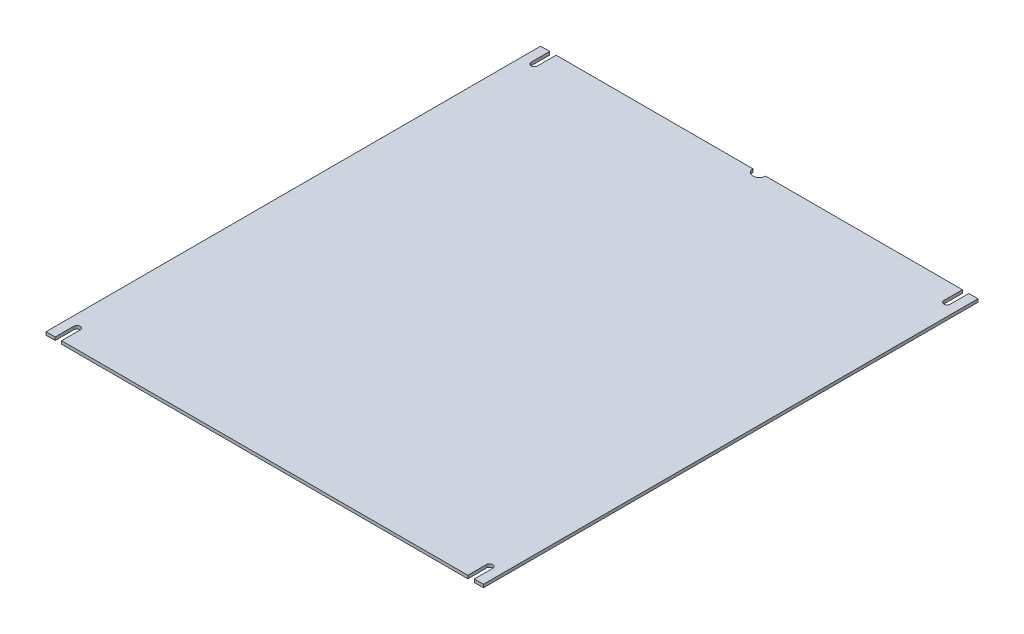
ISO-10303-21;
HEADER;
FILE_DESCRIPTION(('STEP AP214'),'2;1');
FILE_NAME('part.step','',(''),(''),'','','');
FILE_SCHEMA(('AUTOMOTIVE_DESIGN { 1 0 10303 214 1 1 1 1 }'));
ENDSEC;
DATA;
#1=APPLICATION_CONTEXT('core data for automotive mechanical design processes');
#2=APPLICATION_PROTOCOL_DEFINITION('international standard','automotive_design',2000,#1);
#3=PRODUCT_CONTEXT('',#1,'mechanical');
#4=PRODUCT('Part','Part','',(#3));
#5=PRODUCT_RELATED_PRODUCT_CATEGORY('part','',(#4));
#6=PRODUCT_DEFINITION_FORMATION('','',#4);
#7=PRODUCT_DEFINITION_CONTEXT('part definition',#1,'design');
#8=PRODUCT_DEFINITION('design','',#6,#7);
#9=PRODUCT_DEFINITION_SHAPE('','',#8);
#10=(LENGTH_UNIT() NAMED_UNIT(*) SI_UNIT(.MILLI.,.METRE.));
#11=(NAMED_UNIT(*) PLANE_ANGLE_UNIT() SI_UNIT($,.RADIAN.));
#12=(NAMED_UNIT(*) SI_UNIT($,.STERADIAN.) SOLID_ANGLE_UNIT());
#13=UNCERTAINTY_MEASURE_WITH_UNIT(LENGTH_MEASURE(1.E-05),#10,'distance_accuracy_value','');
#14=(GEOMETRIC_REPRESENTATION_CONTEXT(3) GLOBAL_UNCERTAINTY_ASSIGNED_CONTEXT((#13)) GLOBAL_UNIT_ASSIGNED_CONTEXT((#10,
#11,#12)) REPRESENTATION_CONTEXT('',''));
#15=CARTESIAN_POINT('',(0.,0.,0.));
#16=DIRECTION('',(0.,0.,1.));
#17=DIRECTION('',(1.,0.,0.));
#18=AXIS2_PLACEMENT_3D('',#15,#16,#17);
#19=CARTESIAN_POINT('',(0.,-3.175,-508.));
#20=DIRECTION('',(0.,0.,-1.));
#21=DIRECTION('',(-1.,0.,0.));
#22=AXIS2_PLACEMENT_3D('',#19,#20,#21);
#23=PLANE('',#22);
#24=DIRECTION('',(0.,1.,0.));
#25=VECTOR('',#24,1.);
#26=CARTESIAN_POINT('',(218.186,-3.175,-508.));
#27=LINE('',#26,#25);
#28=CARTESIAN_POINT('',(218.186,-3.175,-508.));
#29=VERTEX_POINT('',#28);
#30=CARTESIAN_POINT('',(218.186,0.,-508.));
#31=VERTEX_POINT('',#30);
#32=EDGE_CURVE('E52',#29,#31,#27,.T.);
#33=ORIENTED_EDGE('',*,*,#32,.F.);
#34=DIRECTION('',(-1.,0.,0.));
#35=VECTOR('',#34,1.);
#36=CARTESIAN_POINT('',(0.,-3.175,-508.));
#37=LINE('',#36,#35);
#38=CARTESIAN_POINT('',(16.002,-3.175,-508.));
#39=VERTEX_POINT('',#38);
#40=EDGE_CURVE('E201',#29,#39,#37,.T.);
#41=ORIENTED_EDGE('',*,*,#40,.T.);
#42=DIRECTION('',(0.,1.,0.));
#43=VECTOR('',#42,1.);
#44=CARTESIAN_POINT('',(16.002,-3.175,-508.));
#45=LINE('',#44,#43);
#46=CARTESIAN_POINT('',(16.002,0.,-508.));
#47=VERTEX_POINT('',#46);
#48=EDGE_CURVE('E235',#39,#47,#45,.T.);
#49=ORIENTED_EDGE('',*,*,#48,.T.);
#50=DIRECTION('',(-1.,0.,0.));
#51=VECTOR('',#50,1.);
#52=CARTESIAN_POINT('',(0.,0.,-508.));
#53=LINE('',#52,#51);
#54=EDGE_CURVE('E364',#31,#47,#53,.T.);
#55=ORIENTED_EDGE('',*,*,#54,.F.);
#56=EDGE_LOOP('',(#33,#41,#49,#55));
#57=FACE_BOUND('',#56,.T.);
#58=ADVANCED_FACE('F35',(#57),#23,.T.);
#59=CARTESIAN_POINT('',(0.,-3.175,0.));
#60=DIRECTION('',(0.,0.,1.));
#61=DIRECTION('',(1.,0.,0.));
#62=AXIS2_PLACEMENT_3D('',#59,#60,#61);
#63=PLANE('',#62);
#64=DIRECTION('',(0.,1.,0.));
#65=VECTOR('',#64,1.);
#66=CARTESIAN_POINT('',(439.928,-3.175,0.));
#67=LINE('',#66,#65);
#68=CARTESIAN_POINT('',(439.928,-3.175,0.));
#69=VERTEX_POINT('',#68);
#70=CARTESIAN_POINT('',(439.928,0.,0.));
#71=VERTEX_POINT('',#70);
#72=EDGE_CURVE('E316',#69,#71,#67,.T.);
#73=ORIENTED_EDGE('',*,*,#72,.F.);
#74=DIRECTION('',(1.,0.,0.));
#75=VECTOR('',#74,1.);
#76=CARTESIAN_POINT('',(0.,-3.175,0.));
#77=LINE('',#76,#75);
#78=CARTESIAN_POINT('',(449.326,-3.175,0.));
#79=VERTEX_POINT('',#78);
#80=EDGE_CURVE('E226',#69,#79,#77,.T.);
#81=ORIENTED_EDGE('',*,*,#80,.T.);
#82=DIRECTION('',(0.,1.,0.));
#83=VECTOR('',#82,1.);
#84=CARTESIAN_POINT('',(449.326,-3.175,0.));
#85=LINE('',#84,#83);
#86=CARTESIAN_POINT('',(449.326,0.,0.));
#87=VERTEX_POINT('',#86);
#88=EDGE_CURVE('E366',#79,#87,#85,.T.);
#89=ORIENTED_EDGE('',*,*,#88,.T.);
#90=DIRECTION('',(1.,0.,0.));
#91=VECTOR('',#90,1.);
#92=CARTESIAN_POINT('',(0.,0.,0.));
#93=LINE('',#92,#91);
#94=EDGE_CURVE('E354',#71,#87,#93,.T.);
#95=ORIENTED_EDGE('',*,*,#94,.F.);
#96=EDGE_LOOP('',(#73,#81,#89,#95));
#97=FACE_BOUND('',#96,.T.);
#98=ADVANCED_FACE('F393',(#97),#63,.T.);
#99=DIRECTION('',(0.,1.,0.));
#100=VECTOR('',#99,1.);
#101=CARTESIAN_POINT('',(433.324,-3.175,0.));
#102=LINE('',#101,#100);
#103=CARTESIAN_POINT('',(433.324,-3.175,0.));
#104=VERTEX_POINT('',#103);
#105=CARTESIAN_POINT('',(433.324,0.,0.));
#106=VERTEX_POINT('',#105);
#107=EDGE_CURVE('E312',#104,#106,#102,.T.);
#108=ORIENTED_EDGE('',*,*,#107,.T.);
#109=CARTESIAN_POINT('',(16.002,0.,0.));
#110=VERTEX_POINT('',#109);
#111=EDGE_CURVE('E348',#110,#106,#93,.T.);
#112=ORIENTED_EDGE('',*,*,#111,.F.);
#113=DIRECTION('',(0.,1.,0.));
#114=VECTOR('',#113,1.);
#115=CARTESIAN_POINT('',(16.002,-3.175,0.));
#116=LINE('',#115,#114);
#117=CARTESIAN_POINT('',(16.002,-3.175,0.));
#118=VERTEX_POINT('',#117);
#119=EDGE_CURVE('E291',#118,#110,#116,.T.);
#120=ORIENTED_EDGE('',*,*,#119,.F.);
#121=EDGE_CURVE('E224',#118,#104,#77,.T.);
#122=ORIENTED_EDGE('',*,*,#121,.T.);
#123=EDGE_LOOP('',(#108,#112,#120,#122));
#124=FACE_BOUND('',#123,.T.);
#125=ADVANCED_FACE('F346',(#124),#63,.T.);
#126=DIRECTION('',(0.,1.,0.));
#127=VECTOR('',#126,1.);
#128=CARTESIAN_POINT('',(231.14,-3.175,-508.));
#129=LINE('',#128,#127);
#130=CARTESIAN_POINT('',(231.14,-3.175,-508.));
#131=VERTEX_POINT('',#130);
#132=CARTESIAN_POINT('',(231.14,0.,-508.));
#133=VERTEX_POINT('',#132);
#134=EDGE_CURVE('E184',#131,#133,#129,.T.);
#135=ORIENTED_EDGE('',*,*,#134,.T.);
#136=CARTESIAN_POINT('',(433.324,0.,-508.));
#137=VERTEX_POINT('',#136);
#138=EDGE_CURVE('E363',#137,#133,#53,.T.);
#139=ORIENTED_EDGE('',*,*,#138,.F.);
#140=DIRECTION('',(0.,1.,0.));
#141=VECTOR('',#140,1.);
#142=CARTESIAN_POINT('',(433.324,-3.175,-508.));
#143=LINE('',#142,#141);
#144=CARTESIAN_POINT('',(433.324,-3.175,-508.));
#145=VERTEX_POINT('',#144);
#146=EDGE_CURVE('E205',#145,#137,#143,.T.);
#147=ORIENTED_EDGE('',*,*,#146,.F.);
#148=EDGE_CURVE('E199',#145,#131,#37,.T.);
#149=ORIENTED_EDGE('',*,*,#148,.T.);
#150=EDGE_LOOP('',(#135,#139,#147,#149));
#151=FACE_BOUND('',#150,.T.);
#152=ADVANCED_FACE('F204',(#151),#23,.T.);
#153=DIRECTION('',(0.,1.,0.));
#154=VECTOR('',#153,1.);
#155=CARTESIAN_POINT('',(9.39800000000006,-3.175,-508.));
#156=LINE('',#155,#154);
#157=CARTESIAN_POINT('',(9.39800000000006,-3.175,-508.));
#158=VERTEX_POINT('',#157);
#159=CARTESIAN_POINT('',(9.39800000000006,0.,-508.));
#160=VERTEX_POINT('',#159);
#161=EDGE_CURVE('E239',#158,#160,#156,.T.);
#162=ORIENTED_EDGE('',*,*,#161,.F.);
#163=CARTESIAN_POINT('',(0.,-3.175,-508.));
#164=VERTEX_POINT('',#163);
#165=EDGE_CURVE('E208',#158,#164,#37,.T.);
#166=ORIENTED_EDGE('',*,*,#165,.T.);
#167=DIRECTION('',(0.,1.,0.));
#168=VECTOR('',#167,1.);
#169=CARTESIAN_POINT('',(0.,-3.175,-508.));
#170=LINE('',#169,#168);
#171=CARTESIAN_POINT('',(0.,0.,-508.));
#172=VERTEX_POINT('',#171);
#173=EDGE_CURVE('E11',#164,#172,#170,.T.);
#174=ORIENTED_EDGE('',*,*,#173,.T.);
#175=EDGE_CURVE('E361',#160,#172,#53,.T.);
#176=ORIENTED_EDGE('',*,*,#175,.F.);
#177=EDGE_LOOP('',(#162,#166,#174,#176));
#178=FACE_BOUND('',#177,.T.);
#179=ADVANCED_FACE('F383',(#178),#23,.T.);
#180=CARTESIAN_POINT('',(0.,-3.175,0.));
#181=DIRECTION('',(-1.,0.,0.));
#182=DIRECTION('',(0.,0.,1.));
#183=AXIS2_PLACEMENT_3D('',#180,#181,#182);
#184=PLANE('',#183);
#185=DIRECTION('',(0.,0.,1.));
#186=VECTOR('',#185,1.);
#187=CARTESIAN_POINT('',(0.,0.,0.));
#188=LINE('',#187,#186);
#189=CARTESIAN_POINT('',(0.,0.,0.));
#190=VERTEX_POINT('',#189);
#191=EDGE_CURVE('E243',#172,#190,#188,.T.);
#192=ORIENTED_EDGE('',*,*,#191,.F.);
#193=ORIENTED_EDGE('',*,*,#173,.F.);
#194=DIRECTION('',(0.,0.,1.));
#195=VECTOR('',#194,1.);
#196=CARTESIAN_POINT('',(0.,-3.175,0.));
#197=LINE('',#196,#195);
#198=CARTESIAN_POINT('',(0.,-3.175,0.));
#199=VERTEX_POINT('',#198);
#200=EDGE_CURVE('E228',#164,#199,#197,.T.);
#201=ORIENTED_EDGE('',*,*,#200,.T.);
#202=DIRECTION('',(0.,1.,0.));
#203=VECTOR('',#202,1.);
#204=CARTESIAN_POINT('',(0.,-3.175,0.));
#205=LINE('',#204,#203);
#206=EDGE_CURVE('E39',#199,#190,#205,.T.);
#207=ORIENTED_EDGE('',*,*,#206,.T.);
#208=EDGE_LOOP('',(#192,#193,#201,#207));
#209=FACE_BOUND('',#208,.T.);
#210=ADVANCED_FACE('F37',(#209),#184,.T.);
#211=DIRECTION('',(0.,1.,0.));
#212=VECTOR('',#211,1.);
#213=CARTESIAN_POINT('',(439.928,-3.175,-508.));
#214=LINE('',#213,#212);
#215=CARTESIAN_POINT('',(439.928,-3.175,-508.));
#216=VERTEX_POINT('',#215);
#217=CARTESIAN_POINT('',(439.928,0.,-508.));
#218=VERTEX_POINT('',#217);
#219=EDGE_CURVE('E263',#216,#218,#214,.T.);
#220=ORIENTED_EDGE('',*,*,#219,.T.);
#221=CARTESIAN_POINT('',(449.326,0.,-508.));
#222=VERTEX_POINT('',#221);
#223=EDGE_CURVE('E231',#222,#218,#53,.T.);
#224=ORIENTED_EDGE('',*,*,#223,.F.);
#225=DIRECTION('',(0.,1.,0.));
#226=VECTOR('',#225,1.);
#227=CARTESIAN_POINT('',(449.326,-3.175,-508.));
#228=LINE('',#227,#226);
#229=CARTESIAN_POINT('',(449.326,-3.175,-508.));
#230=VERTEX_POINT('',#229);
#231=EDGE_CURVE('E44',#230,#222,#228,.T.);
#232=ORIENTED_EDGE('',*,*,#231,.F.);
#233=EDGE_CURVE('E206',#230,#216,#37,.T.);
#234=ORIENTED_EDGE('',*,*,#233,.T.);
#235=EDGE_LOOP('',(#220,#224,#232,#234));
#236=FACE_BOUND('',#235,.T.);
#237=ADVANCED_FACE('F397',(#236),#23,.T.);
#238=CARTESIAN_POINT('',(449.326,-3.175,0.));
#239=DIRECTION('',(1.,0.,0.));
#240=DIRECTION('',(0.,0.,-1.));
#241=AXIS2_PLACEMENT_3D('',#238,#239,#240);
#242=PLANE('',#241);
#243=DIRECTION('',(0.,0.,-1.));
#244=VECTOR('',#243,1.);
#245=CARTESIAN_POINT('',(449.326,0.,0.));
#246=LINE('',#245,#244);
#247=EDGE_CURVE('E357',#87,#222,#246,.T.);
#248=ORIENTED_EDGE('',*,*,#247,.F.);
#249=ORIENTED_EDGE('',*,*,#88,.F.);
#250=DIRECTION('',(0.,0.,-1.));
#251=VECTOR('',#250,1.);
#252=CARTESIAN_POINT('',(449.326,-3.175,0.));
#253=LINE('',#252,#251);
#254=EDGE_CURVE('E212',#79,#230,#253,.T.);
#255=ORIENTED_EDGE('',*,*,#254,.T.);
#256=ORIENTED_EDGE('',*,*,#231,.T.);
#257=EDGE_LOOP('',(#248,#249,#255,#256));
#258=FACE_BOUND('',#257,.T.);
#259=ADVANCED_FACE('F394',(#258),#242,.T.);
#260=DIRECTION('',(0.,1.,0.));
#261=VECTOR('',#260,1.);
#262=CARTESIAN_POINT('',(9.398,-3.175,0.));
#263=LINE('',#262,#261);
#264=CARTESIAN_POINT('',(9.398,-3.175,0.));
#265=VERTEX_POINT('',#264);
#266=CARTESIAN_POINT('',(9.398,0.,0.));
#267=VERTEX_POINT('',#266);
#268=EDGE_CURVE('E287',#265,#267,#263,.T.);
#269=ORIENTED_EDGE('',*,*,#268,.T.);
#270=EDGE_CURVE('E353',#190,#267,#93,.T.);
#271=ORIENTED_EDGE('',*,*,#270,.F.);
#272=ORIENTED_EDGE('',*,*,#206,.F.);
#273=EDGE_CURVE('E218',#199,#265,#77,.T.);
#274=ORIENTED_EDGE('',*,*,#273,.T.);
#275=EDGE_LOOP('',(#269,#271,#272,#274));
#276=FACE_BOUND('',#275,.T.);
#277=ADVANCED_FACE('F378',(#276),#63,.T.);
#278=CARTESIAN_POINT('',(0.,-3.175,0.));
#279=DIRECTION('',(0.,-1.,0.));
#280=DIRECTION('',(0.,0.,-1.));
#281=AXIS2_PLACEMENT_3D('',#278,#279,#280);
#282=PLANE('',#281);
#283=CARTESIAN_POINT('',(224.663,-3.175,-508.));
#284=DIRECTION('',(0.,1.,0.));
#285=DIRECTION('',(0.,0.,1.));
#286=AXIS2_PLACEMENT_3D('',#283,#284,#285);
#287=CIRCLE('',#286,6.47700000000001);
#288=EDGE_CURVE('E187',#29,#131,#287,.T.);
#289=ORIENTED_EDGE('',*,*,#288,.T.);
#290=ORIENTED_EDGE('',*,*,#148,.F.);
#291=DIRECTION('',(0.,0.,1.));
#292=VECTOR('',#291,1.);
#293=CARTESIAN_POINT('',(433.324,-3.175,-488.95));
#294=LINE('',#293,#292);
#295=CARTESIAN_POINT('',(433.324,-3.175,-488.95));
#296=VERTEX_POINT('',#295);
#297=EDGE_CURVE('E264',#145,#296,#294,.T.);
#298=ORIENTED_EDGE('',*,*,#297,.T.);
#299=CARTESIAN_POINT('',(436.626,-3.175,-488.95));
#300=DIRECTION('',(0.,1.,0.));
#301=DIRECTION('',(0.,0.,1.));
#302=AXIS2_PLACEMENT_3D('',#299,#300,#301);
#303=CIRCLE('',#302,3.30200000000003);
#304=CARTESIAN_POINT('',(439.928,-3.175,-488.95));
#305=VERTEX_POINT('',#304);
#306=EDGE_CURVE('E272',#296,#305,#303,.T.);
#307=ORIENTED_EDGE('',*,*,#306,.T.);
#308=DIRECTION('',(0.,0.,-1.));
#309=VECTOR('',#308,1.);
#310=CARTESIAN_POINT('',(439.928,-3.175,-508.));
#311=LINE('',#310,#309);
#312=EDGE_CURVE('E279',#305,#216,#311,.T.);
#313=ORIENTED_EDGE('',*,*,#312,.T.);
#314=ORIENTED_EDGE('',*,*,#233,.F.);
#315=ORIENTED_EDGE('',*,*,#254,.F.);
#316=ORIENTED_EDGE('',*,*,#80,.F.);
#317=DIRECTION('',(0.,0.,-1.));
#318=VECTOR('',#317,1.);
#319=CARTESIAN_POINT('',(439.928,-3.175,0.));
#320=LINE('',#319,#318);
#321=CARTESIAN_POINT('',(439.928,-3.175,-19.05));
#322=VERTEX_POINT('',#321);
#323=EDGE_CURVE('E313',#69,#322,#320,.T.);
#324=ORIENTED_EDGE('',*,*,#323,.T.);
#325=CARTESIAN_POINT('',(436.626,-3.175,-19.05));
#326=DIRECTION('',(0.,1.,0.));
#327=DIRECTION('',(0.,0.,1.));
#328=AXIS2_PLACEMENT_3D('',#325,#326,#327);
#329=CIRCLE('',#328,3.30200000000003);
#330=CARTESIAN_POINT('',(433.324,-3.175,-19.05));
#331=VERTEX_POINT('',#330);
#332=EDGE_CURVE('E322',#322,#331,#329,.T.);
#333=ORIENTED_EDGE('',*,*,#332,.T.);
#334=DIRECTION('',(0.,0.,1.));
#335=VECTOR('',#334,1.);
#336=CARTESIAN_POINT('',(433.324,-3.175,-19.05));
#337=LINE('',#336,#335);
#338=EDGE_CURVE('E328',#331,#104,#337,.T.);
#339=ORIENTED_EDGE('',*,*,#338,.T.);
#340=ORIENTED_EDGE('',*,*,#121,.F.);
#341=DIRECTION('',(0.,0.,-1.));
#342=VECTOR('',#341,1.);
#343=CARTESIAN_POINT('',(16.002,-3.175,-19.05));
#344=LINE('',#343,#342);
#345=CARTESIAN_POINT('',(16.002,-3.175,-19.05));
#346=VERTEX_POINT('',#345);
#347=EDGE_CURVE('E288',#118,#346,#344,.T.);
#348=ORIENTED_EDGE('',*,*,#347,.T.);
#349=CARTESIAN_POINT('',(12.7,-3.175,-19.05));
#350=DIRECTION('',(0.,1.,0.));
#351=DIRECTION('',(0.,0.,1.));
#352=AXIS2_PLACEMENT_3D('',#349,#350,#351);
#353=CIRCLE('',#352,3.302);
#354=CARTESIAN_POINT('',(9.398,-3.175,-19.05));
#355=VERTEX_POINT('',#354);
#356=EDGE_CURVE('E297',#346,#355,#353,.T.);
#357=ORIENTED_EDGE('',*,*,#356,.T.);
#358=DIRECTION('',(0.,0.,1.));
#359=VECTOR('',#358,1.);
#360=CARTESIAN_POINT('',(9.398,-3.175,-19.05));
#361=LINE('',#360,#359);
#362=EDGE_CURVE('E305',#355,#265,#361,.T.);
#363=ORIENTED_EDGE('',*,*,#362,.T.);
#364=ORIENTED_EDGE('',*,*,#273,.F.);
#365=ORIENTED_EDGE('',*,*,#200,.F.);
#366=ORIENTED_EDGE('',*,*,#165,.F.);
#367=DIRECTION('',(0.,0.,1.));
#368=VECTOR('',#367,1.);
#369=CARTESIAN_POINT('',(9.39800000000001,-3.175,-488.95));
#370=LINE('',#369,#368);
#371=CARTESIAN_POINT('',(9.39800000000001,-3.175,-488.95));
#372=VERTEX_POINT('',#371);
#373=EDGE_CURVE('E236',#158,#372,#370,.T.);
#374=ORIENTED_EDGE('',*,*,#373,.T.);
#375=CARTESIAN_POINT('',(12.7,-3.175,-488.95));
#376=DIRECTION('',(0.,1.,0.));
#377=DIRECTION('',(0.,0.,1.));
#378=AXIS2_PLACEMENT_3D('',#375,#376,#377);
#379=CIRCLE('',#378,3.30199999999999);
#380=CARTESIAN_POINT('',(16.002,-3.175,-488.95));
#381=VERTEX_POINT('',#380);
#382=EDGE_CURVE('E247',#372,#381,#379,.T.);
#383=ORIENTED_EDGE('',*,*,#382,.T.);
#384=DIRECTION('',(0.,0.,-1.));
#385=VECTOR('',#384,1.);
#386=CARTESIAN_POINT('',(16.002,-3.175,-508.));
#387=LINE('',#386,#385);
#388=EDGE_CURVE('E256',#381,#39,#387,.T.);
#389=ORIENTED_EDGE('',*,*,#388,.T.);
#390=ORIENTED_EDGE('',*,*,#40,.F.);
#391=EDGE_LOOP('',(#289,#290,#298,#307,#313,#314,#315,#316,#324,#333,#339,#340,#348,#357,#363,
#364,#365,#366,#374,#383,#389,#390));
#392=FACE_BOUND('',#391,.T.);
#393=ADVANCED_FACE('F197',(#392),#282,.T.);
#394=CARTESIAN_POINT('',(0.,0.,0.));
#395=DIRECTION('',(0.,-1.,0.));
#396=DIRECTION('',(0.,0.,-1.));
#397=AXIS2_PLACEMENT_3D('',#394,#395,#396);
#398=PLANE('',#397);
#399=ORIENTED_EDGE('',*,*,#138,.T.);
#400=CARTESIAN_POINT('',(224.663,0.,-508.));
#401=DIRECTION('',(0.,1.,0.));
#402=DIRECTION('',(0.,0.,1.));
#403=AXIS2_PLACEMENT_3D('',#400,#401,#402);
#404=CIRCLE('',#403,6.47700000000001);
#405=EDGE_CURVE('E188',#31,#133,#404,.T.);
#406=ORIENTED_EDGE('',*,*,#405,.F.);
#407=ORIENTED_EDGE('',*,*,#54,.T.);
#408=DIRECTION('',(0.,0.,-1.));
#409=VECTOR('',#408,1.);
#410=CARTESIAN_POINT('',(16.002,0.,-508.));
#411=LINE('',#410,#409);
#412=CARTESIAN_POINT('',(16.002,0.,-488.95));
#413=VERTEX_POINT('',#412);
#414=EDGE_CURVE('E248',#413,#47,#411,.T.);
#415=ORIENTED_EDGE('',*,*,#414,.F.);
#416=CARTESIAN_POINT('',(12.7,0.,-488.95));
#417=DIRECTION('',(0.,1.,0.));
#418=DIRECTION('',(0.,0.,1.));
#419=AXIS2_PLACEMENT_3D('',#416,#417,#418);
#420=CIRCLE('',#419,3.30199999999999);
#421=CARTESIAN_POINT('',(9.39800000000001,0.,-488.95));
#422=VERTEX_POINT('',#421);
#423=EDGE_CURVE('E251',#422,#413,#420,.T.);
#424=ORIENTED_EDGE('',*,*,#423,.F.);
#425=DIRECTION('',(0.,0.,1.));
#426=VECTOR('',#425,1.);
#427=CARTESIAN_POINT('',(9.39800000000001,0.,-488.95));
#428=LINE('',#427,#426);
#429=EDGE_CURVE('E244',#160,#422,#428,.T.);
#430=ORIENTED_EDGE('',*,*,#429,.F.);
#431=ORIENTED_EDGE('',*,*,#175,.T.);
#432=ORIENTED_EDGE('',*,*,#191,.T.);
#433=ORIENTED_EDGE('',*,*,#270,.T.);
#434=DIRECTION('',(0.,0.,1.));
#435=VECTOR('',#434,1.);
#436=CARTESIAN_POINT('',(9.398,0.,-19.05));
#437=LINE('',#436,#435);
#438=CARTESIAN_POINT('',(9.398,0.,-19.05));
#439=VERTEX_POINT('',#438);
#440=EDGE_CURVE('E298',#439,#267,#437,.T.);
#441=ORIENTED_EDGE('',*,*,#440,.F.);
#442=CARTESIAN_POINT('',(12.7,0.,-19.05));
#443=DIRECTION('',(0.,1.,0.));
#444=DIRECTION('',(0.,0.,1.));
#445=AXIS2_PLACEMENT_3D('',#442,#443,#444);
#446=CIRCLE('',#445,3.302);
#447=CARTESIAN_POINT('',(16.002,0.,-19.05));
#448=VERTEX_POINT('',#447);
#449=EDGE_CURVE('E300',#448,#439,#446,.T.);
#450=ORIENTED_EDGE('',*,*,#449,.F.);
#451=DIRECTION('',(0.,0.,-1.));
#452=VECTOR('',#451,1.);
#453=CARTESIAN_POINT('',(16.002,0.,-19.05));
#454=LINE('',#453,#452);
#455=EDGE_CURVE('E294',#110,#448,#454,.T.);
#456=ORIENTED_EDGE('',*,*,#455,.F.);
#457=ORIENTED_EDGE('',*,*,#111,.T.);
#458=DIRECTION('',(0.,0.,1.));
#459=VECTOR('',#458,1.);
#460=CARTESIAN_POINT('',(433.324,0.,-19.05));
#461=LINE('',#460,#459);
#462=CARTESIAN_POINT('',(433.324,0.,-19.05));
#463=VERTEX_POINT('',#462);
#464=EDGE_CURVE('E323',#463,#106,#461,.T.);
#465=ORIENTED_EDGE('',*,*,#464,.F.);
#466=CARTESIAN_POINT('',(436.626,0.,-19.05));
#467=DIRECTION('',(0.,1.,0.));
#468=DIRECTION('',(0.,0.,1.));
#469=AXIS2_PLACEMENT_3D('',#466,#467,#468);
#470=CIRCLE('',#469,3.30200000000003);
#471=CARTESIAN_POINT('',(439.928,0.,-19.05));
#472=VERTEX_POINT('',#471);
#473=EDGE_CURVE('E60',#472,#463,#470,.T.);
#474=ORIENTED_EDGE('',*,*,#473,.F.);
#475=DIRECTION('',(0.,0.,-1.));
#476=VECTOR('',#475,1.);
#477=CARTESIAN_POINT('',(439.928,0.,0.));
#478=LINE('',#477,#476);
#479=EDGE_CURVE('E319',#71,#472,#478,.T.);
#480=ORIENTED_EDGE('',*,*,#479,.F.);
#481=ORIENTED_EDGE('',*,*,#94,.T.);
#482=ORIENTED_EDGE('',*,*,#247,.T.);
#483=ORIENTED_EDGE('',*,*,#223,.T.);
#484=DIRECTION('',(0.,0.,-1.));
#485=VECTOR('',#484,1.);
#486=CARTESIAN_POINT('',(439.928,0.,-508.));
#487=LINE('',#486,#485);
#488=CARTESIAN_POINT('',(439.928,0.,-488.95));
#489=VERTEX_POINT('',#488);
#490=EDGE_CURVE('E273',#489,#218,#487,.T.);
#491=ORIENTED_EDGE('',*,*,#490,.F.);
#492=CARTESIAN_POINT('',(436.626,0.,-488.95));
#493=DIRECTION('',(0.,1.,0.));
#494=DIRECTION('',(0.,0.,1.));
#495=AXIS2_PLACEMENT_3D('',#492,#493,#494);
#496=CIRCLE('',#495,3.30200000000003);
#497=CARTESIAN_POINT('',(433.324,0.,-488.95));
#498=VERTEX_POINT('',#497);
#499=EDGE_CURVE('E275',#498,#489,#496,.T.);
#500=ORIENTED_EDGE('',*,*,#499,.F.);
#501=DIRECTION('',(0.,0.,1.));
#502=VECTOR('',#501,1.);
#503=CARTESIAN_POINT('',(433.324,0.,-488.95));
#504=LINE('',#503,#502);
#505=EDGE_CURVE('E269',#137,#498,#504,.T.);
#506=ORIENTED_EDGE('',*,*,#505,.F.);
#507=EDGE_LOOP('',(#399,#406,#407,#415,#424,#430,#431,#432,#433,#441,#450,#456,#457,#465,#474,
#480,#481,#482,#483,#491,#500,#506));
#508=FACE_BOUND('',#507,.T.);
#509=ADVANCED_FACE('F351',(#508),#398,.F.);
#510=CARTESIAN_POINT('',(12.7,-3.175,-488.95));
#511=DIRECTION('',(0.,1.,0.));
#512=DIRECTION('',(0.,0.,1.));
#513=AXIS2_PLACEMENT_3D('',#510,#511,#512);
#514=CYLINDRICAL_SURFACE('',#513,3.30199999999999);
#515=ORIENTED_EDGE('',*,*,#423,.T.);
#516=DIRECTION('',(0.,1.,0.));
#517=VECTOR('',#516,1.);
#518=CARTESIAN_POINT('',(16.002,-3.175,-488.95));
#519=LINE('',#518,#517);
#520=EDGE_CURVE('E232',#381,#413,#519,.T.);
#521=ORIENTED_EDGE('',*,*,#520,.F.);
#522=ORIENTED_EDGE('',*,*,#382,.F.);
#523=DIRECTION('',(0.,1.,0.));
#524=VECTOR('',#523,1.);
#525=CARTESIAN_POINT('',(9.39800000000001,-3.175,-488.95));
#526=LINE('',#525,#524);
#527=EDGE_CURVE('E241',#372,#422,#526,.T.);
#528=ORIENTED_EDGE('',*,*,#527,.T.);
#529=EDGE_LOOP('',(#515,#521,#522,#528));
#530=FACE_BOUND('',#529,.T.);
#531=ADVANCED_FACE('F485',(#530),#514,.F.);
#532=CARTESIAN_POINT('',(9.39800000000001,-3.175,-488.95));
#533=DIRECTION('',(-1.,0.,0.));
#534=DIRECTION('',(0.,0.,1.));
#535=AXIS2_PLACEMENT_3D('',#532,#533,#534);
#536=PLANE('',#535);
#537=ORIENTED_EDGE('',*,*,#429,.T.);
#538=ORIENTED_EDGE('',*,*,#527,.F.);
#539=ORIENTED_EDGE('',*,*,#373,.F.);
#540=ORIENTED_EDGE('',*,*,#161,.T.);
#541=EDGE_LOOP('',(#537,#538,#539,#540));
#542=FACE_BOUND('',#541,.T.);
#543=ADVANCED_FACE('F518',(#542),#536,.F.);
#544=CARTESIAN_POINT('',(16.002,-3.175,-508.));
#545=DIRECTION('',(1.,0.,0.));
#546=DIRECTION('',(0.,0.,-1.));
#547=AXIS2_PLACEMENT_3D('',#544,#545,#546);
#548=PLANE('',#547);
#549=ORIENTED_EDGE('',*,*,#414,.T.);
#550=ORIENTED_EDGE('',*,*,#48,.F.);
#551=ORIENTED_EDGE('',*,*,#388,.F.);
#552=ORIENTED_EDGE('',*,*,#520,.T.);
#553=EDGE_LOOP('',(#549,#550,#551,#552));
#554=FACE_BOUND('',#553,.T.);
#555=ADVANCED_FACE('F529',(#554),#548,.F.);
#556=CARTESIAN_POINT('',(436.626,-3.175,-488.95));
#557=DIRECTION('',(0.,1.,0.));
#558=DIRECTION('',(0.,0.,1.));
#559=AXIS2_PLACEMENT_3D('',#556,#557,#558);
#560=CYLINDRICAL_SURFACE('',#559,3.30200000000003);
#561=ORIENTED_EDGE('',*,*,#499,.T.);
#562=DIRECTION('',(0.,1.,0.));
#563=VECTOR('',#562,1.);
#564=CARTESIAN_POINT('',(439.928,-3.175,-488.95));
#565=LINE('',#564,#563);
#566=EDGE_CURVE('E260',#305,#489,#565,.T.);
#567=ORIENTED_EDGE('',*,*,#566,.F.);
#568=ORIENTED_EDGE('',*,*,#306,.F.);
#569=DIRECTION('',(0.,1.,0.));
#570=VECTOR('',#569,1.);
#571=CARTESIAN_POINT('',(433.324,-3.175,-488.95));
#572=LINE('',#571,#570);
#573=EDGE_CURVE('E253',#296,#498,#572,.T.);
#574=ORIENTED_EDGE('',*,*,#573,.T.);
#575=EDGE_LOOP('',(#561,#567,#568,#574));
#576=FACE_BOUND('',#575,.T.);
#577=ADVANCED_FACE('F540',(#576),#560,.F.);
#578=CARTESIAN_POINT('',(433.324,-3.175,-488.95));
#579=DIRECTION('',(-1.,0.,0.));
#580=DIRECTION('',(0.,0.,1.));
#581=AXIS2_PLACEMENT_3D('',#578,#579,#580);
#582=PLANE('',#581);
#583=ORIENTED_EDGE('',*,*,#505,.T.);
#584=ORIENTED_EDGE('',*,*,#573,.F.);
#585=ORIENTED_EDGE('',*,*,#297,.F.);
#586=ORIENTED_EDGE('',*,*,#146,.T.);
#587=EDGE_LOOP('',(#583,#584,#585,#586));
#588=FACE_BOUND('',#587,.T.);
#589=ADVANCED_FACE('F551',(#588),#582,.F.);
#590=CARTESIAN_POINT('',(439.928,-3.175,-508.));
#591=DIRECTION('',(1.,0.,0.));
#592=DIRECTION('',(0.,0.,-1.));
#593=AXIS2_PLACEMENT_3D('',#590,#591,#592);
#594=PLANE('',#593);
#595=ORIENTED_EDGE('',*,*,#490,.T.);
#596=ORIENTED_EDGE('',*,*,#219,.F.);
#597=ORIENTED_EDGE('',*,*,#312,.F.);
#598=ORIENTED_EDGE('',*,*,#566,.T.);
#599=EDGE_LOOP('',(#595,#596,#597,#598));
#600=FACE_BOUND('',#599,.T.);
#601=ADVANCED_FACE('F562',(#600),#594,.F.);
#602=CARTESIAN_POINT('',(12.7,-3.175,-19.05));
#603=DIRECTION('',(0.,1.,0.));
#604=DIRECTION('',(0.,0.,1.));
#605=AXIS2_PLACEMENT_3D('',#602,#603,#604);
#606=CYLINDRICAL_SURFACE('',#605,3.302);
#607=ORIENTED_EDGE('',*,*,#449,.T.);
#608=DIRECTION('',(0.,1.,0.));
#609=VECTOR('',#608,1.);
#610=CARTESIAN_POINT('',(9.398,-3.175,-19.05));
#611=LINE('',#610,#609);
#612=EDGE_CURVE('E284',#355,#439,#611,.T.);
#613=ORIENTED_EDGE('',*,*,#612,.F.);
#614=ORIENTED_EDGE('',*,*,#356,.F.);
#615=DIRECTION('',(0.,1.,0.));
#616=VECTOR('',#615,1.);
#617=CARTESIAN_POINT('',(16.002,-3.175,-19.05));
#618=LINE('',#617,#616);
#619=EDGE_CURVE('E277',#346,#448,#618,.T.);
#620=ORIENTED_EDGE('',*,*,#619,.T.);
#621=EDGE_LOOP('',(#607,#613,#614,#620));
#622=FACE_BOUND('',#621,.T.);
#623=ADVANCED_FACE('F389',(#622),#606,.F.);
#624=CARTESIAN_POINT('',(16.002,-3.175,-19.05));
#625=DIRECTION('',(1.,0.,0.));
#626=DIRECTION('',(0.,0.,-1.));
#627=AXIS2_PLACEMENT_3D('',#624,#625,#626);
#628=PLANE('',#627);
#629=ORIENTED_EDGE('',*,*,#455,.T.);
#630=ORIENTED_EDGE('',*,*,#619,.F.);
#631=ORIENTED_EDGE('',*,*,#347,.F.);
#632=ORIENTED_EDGE('',*,*,#119,.T.);
#633=EDGE_LOOP('',(#629,#630,#631,#632));
#634=FACE_BOUND('',#633,.T.);
#635=ADVANCED_FACE('F391',(#634),#628,.F.);
#636=CARTESIAN_POINT('',(9.398,-3.175,-19.05));
#637=DIRECTION('',(-1.,0.,0.));
#638=DIRECTION('',(0.,0.,1.));
#639=AXIS2_PLACEMENT_3D('',#636,#637,#638);
#640=PLANE('',#639);
#641=ORIENTED_EDGE('',*,*,#440,.T.);
#642=ORIENTED_EDGE('',*,*,#268,.F.);
#643=ORIENTED_EDGE('',*,*,#362,.F.);
#644=ORIENTED_EDGE('',*,*,#612,.T.);
#645=EDGE_LOOP('',(#641,#642,#643,#644));
#646=FACE_BOUND('',#645,.T.);
#647=ADVANCED_FACE('F387',(#646),#640,.F.);
#648=CARTESIAN_POINT('',(436.626,-3.175,-19.05));
#649=DIRECTION('',(0.,1.,0.));
#650=DIRECTION('',(0.,0.,1.));
#651=AXIS2_PLACEMENT_3D('',#648,#649,#650);
#652=CYLINDRICAL_SURFACE('',#651,3.30200000000003);
#653=ORIENTED_EDGE('',*,*,#473,.T.);
#654=DIRECTION('',(0.,1.,0.));
#655=VECTOR('',#654,1.);
#656=CARTESIAN_POINT('',(433.324,-3.175,-19.05));
#657=LINE('',#656,#655);
#658=EDGE_CURVE('E310',#331,#463,#657,.T.);
#659=ORIENTED_EDGE('',*,*,#658,.F.);
#660=ORIENTED_EDGE('',*,*,#332,.F.);
#661=DIRECTION('',(0.,1.,0.));
#662=VECTOR('',#661,1.);
#663=CARTESIAN_POINT('',(439.928,-3.175,-19.05));
#664=LINE('',#663,#662);
#665=EDGE_CURVE('E302',#322,#472,#664,.T.);
#666=ORIENTED_EDGE('',*,*,#665,.T.);
#667=EDGE_LOOP('',(#653,#659,#660,#666));
#668=FACE_BOUND('',#667,.T.);
#669=ADVANCED_FACE('F339',(#668),#652,.F.);
#670=CARTESIAN_POINT('',(439.928,-3.175,0.));
#671=DIRECTION('',(1.,0.,0.));
#672=DIRECTION('',(0.,0.,-1.));
#673=AXIS2_PLACEMENT_3D('',#670,#671,#672);
#674=PLANE('',#673);
#675=ORIENTED_EDGE('',*,*,#479,.T.);
#676=ORIENTED_EDGE('',*,*,#665,.F.);
#677=ORIENTED_EDGE('',*,*,#323,.F.);
#678=ORIENTED_EDGE('',*,*,#72,.T.);
#679=EDGE_LOOP('',(#675,#676,#677,#678));
#680=FACE_BOUND('',#679,.T.);
#681=ADVANCED_FACE('F402',(#680),#674,.F.);
#682=CARTESIAN_POINT('',(433.324,-3.175,-19.05));
#683=DIRECTION('',(-1.,0.,0.));
#684=DIRECTION('',(0.,0.,1.));
#685=AXIS2_PLACEMENT_3D('',#682,#683,#684);
#686=PLANE('',#685);
#687=ORIENTED_EDGE('',*,*,#464,.T.);
#688=ORIENTED_EDGE('',*,*,#107,.F.);
#689=ORIENTED_EDGE('',*,*,#338,.F.);
#690=ORIENTED_EDGE('',*,*,#658,.T.);
#691=EDGE_LOOP('',(#687,#688,#689,#690));
#692=FACE_BOUND('',#691,.T.);
#693=ADVANCED_FACE('F342',(#692),#686,.F.);
#694=CARTESIAN_POINT('',(224.663,-3.175,-508.));
#695=DIRECTION('',(0.,1.,0.));
#696=DIRECTION('',(0.,0.,1.));
#697=AXIS2_PLACEMENT_3D('',#694,#695,#696);
#698=CYLINDRICAL_SURFACE('',#697,6.47700000000001);
#699=ORIENTED_EDGE('',*,*,#405,.T.);
#700=ORIENTED_EDGE('',*,*,#134,.F.);
#701=ORIENTED_EDGE('',*,*,#288,.F.);
#702=ORIENTED_EDGE('',*,*,#32,.T.);
#703=EDGE_LOOP('',(#699,#700,#701,#702));
#704=FACE_BOUND('',#703,.T.);
#705=ADVANCED_FACE('F186',(#704),#698,.F.);
#706=CLOSED_SHELL('',(#58,#98,#125,#152,#179,#210,#237,#259,#277,#393,#509,#531,#543,#555,#577,
#589,#601,#623,#635,#647,#669,#681,#693,#705));
#707=MANIFOLD_SOLID_BREP('B2',#706);
#708=ADVANCED_BREP_SHAPE_REPRESENTATION('',(#18,#707),#14);
#709=SHAPE_DEFINITION_REPRESENTATION(#9,#708);
ENDSEC;
END-ISO-10303-21;
